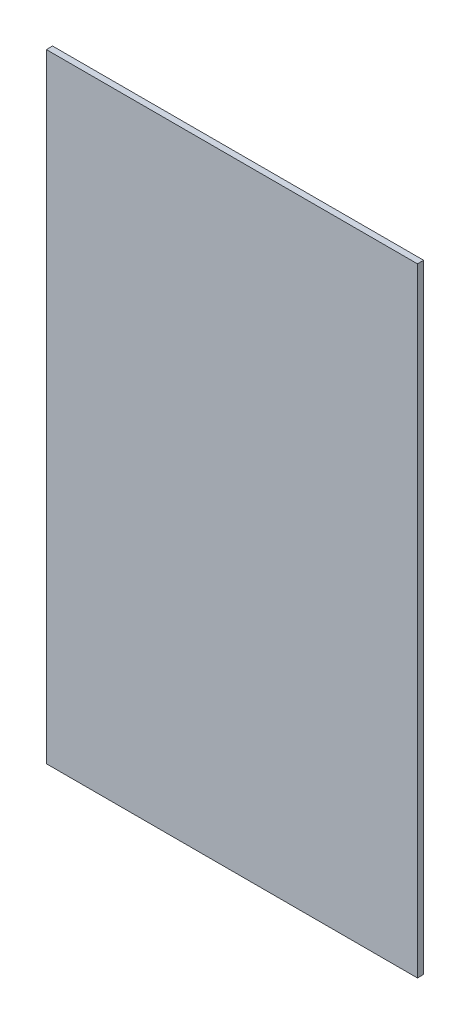
ISO-10303-21;
HEADER;
FILE_DESCRIPTION(('STEP AP214'),'2;1');
FILE_NAME('part.step','',(''),(''),'','','');
FILE_SCHEMA(('AUTOMOTIVE_DESIGN { 1 0 10303 214 1 1 1 1 }'));
ENDSEC;
DATA;
#1=APPLICATION_CONTEXT('core data for automotive mechanical design processes');
#2=APPLICATION_PROTOCOL_DEFINITION('international standard','automotive_design',2000,#1);
#3=PRODUCT_CONTEXT('',#1,'mechanical');
#4=PRODUCT('Part','Part','',(#3));
#5=PRODUCT_RELATED_PRODUCT_CATEGORY('part','',(#4));
#6=PRODUCT_DEFINITION_FORMATION('','',#4);
#7=PRODUCT_DEFINITION_CONTEXT('part definition',#1,'design');
#8=PRODUCT_DEFINITION('design','',#6,#7);
#9=PRODUCT_DEFINITION_SHAPE('','',#8);
#10=(LENGTH_UNIT() NAMED_UNIT(*) SI_UNIT(.MILLI.,.METRE.));
#11=(NAMED_UNIT(*) PLANE_ANGLE_UNIT() SI_UNIT($,.RADIAN.));
#12=(NAMED_UNIT(*) SI_UNIT($,.STERADIAN.) SOLID_ANGLE_UNIT());
#13=UNCERTAINTY_MEASURE_WITH_UNIT(LENGTH_MEASURE(1.E-05),#10,'distance_accuracy_value','');
#14=(GEOMETRIC_REPRESENTATION_CONTEXT(3) GLOBAL_UNCERTAINTY_ASSIGNED_CONTEXT((#13)) GLOBAL_UNIT_ASSIGNED_CONTEXT((#10,
#11,#12)) REPRESENTATION_CONTEXT('',''));
#15=CARTESIAN_POINT('',(0.,0.,0.));
#16=DIRECTION('',(0.,0.,1.));
#17=DIRECTION('',(1.,0.,0.));
#18=AXIS2_PLACEMENT_3D('',#15,#16,#17);
#19=CARTESIAN_POINT('',(-30.9627304007322,42.0574162679426,1.));
#20=DIRECTION('',(1.,0.,0.));
#21=DIRECTION('',(0.,1.,0.));
#22=AXIS2_PLACEMENT_3D('',#19,#20,#21);
#23=PLANE('',#22);
#24=DIRECTION('',(0.,-1.,0.));
#25=VECTOR('',#24,1.);
#26=CARTESIAN_POINT('',(-30.9627304007322,42.0574162679426,0.));
#27=LINE('',#26,#25);
#28=CARTESIAN_POINT('',(-30.9627304007322,42.0574162679426,0.));
#29=VERTEX_POINT('',#28);
#30=CARTESIAN_POINT('',(-30.9627304007322,-57.9425837320574,0.));
#31=VERTEX_POINT('',#30);
#32=EDGE_CURVE('E96',#29,#31,#27,.T.);
#33=ORIENTED_EDGE('',*,*,#32,.T.);
#34=DIRECTION('',(0.,0.,-1.));
#35=VECTOR('',#34,1.);
#36=CARTESIAN_POINT('',(-30.9627304007322,-57.9425837320574,1.));
#37=LINE('',#36,#35);
#38=CARTESIAN_POINT('',(-30.9627304007322,-57.9425837320574,1.));
#39=VERTEX_POINT('',#38);
#40=EDGE_CURVE('E11',#39,#31,#37,.T.);
#41=ORIENTED_EDGE('',*,*,#40,.F.);
#42=DIRECTION('',(0.,-1.,0.));
#43=VECTOR('',#42,1.);
#44=CARTESIAN_POINT('',(-30.9627304007322,42.0574162679426,1.));
#45=LINE('',#44,#43);
#46=CARTESIAN_POINT('',(-30.9627304007322,42.0574162679426,1.));
#47=VERTEX_POINT('',#46);
#48=EDGE_CURVE('E84',#47,#39,#45,.T.);
#49=ORIENTED_EDGE('',*,*,#48,.F.);
#50=DIRECTION('',(0.,0.,-1.));
#51=VECTOR('',#50,1.);
#52=CARTESIAN_POINT('',(-30.9627304007322,42.0574162679426,1.));
#53=LINE('',#52,#51);
#54=EDGE_CURVE('E92',#47,#29,#53,.T.);
#55=ORIENTED_EDGE('',*,*,#54,.T.);
#56=EDGE_LOOP('',(#33,#41,#49,#55));
#57=FACE_BOUND('',#56,.T.);
#58=ADVANCED_FACE('F33',(#57),#23,.F.);
#59=CARTESIAN_POINT('',(-30.9627304007322,-57.9425837320574,1.));
#60=DIRECTION('',(0.,1.,0.));
#61=DIRECTION('',(0.,0.,1.));
#62=AXIS2_PLACEMENT_3D('',#59,#60,#61);
#63=PLANE('',#62);
#64=DIRECTION('',(1.,0.,0.));
#65=VECTOR('',#64,1.);
#66=CARTESIAN_POINT('',(-30.9627304007322,-57.9425837320574,0.));
#67=LINE('',#66,#65);
#68=CARTESIAN_POINT('',(29.0372695992678,-57.9425837320574,0.));
#69=VERTEX_POINT('',#68);
#70=EDGE_CURVE('E88',#31,#69,#67,.T.);
#71=ORIENTED_EDGE('',*,*,#70,.T.);
#72=DIRECTION('',(0.,0.,-1.));
#73=VECTOR('',#72,1.);
#74=CARTESIAN_POINT('',(29.0372695992678,-57.9425837320574,1.));
#75=LINE('',#74,#73);
#76=CARTESIAN_POINT('',(29.0372695992678,-57.9425837320574,1.));
#77=VERTEX_POINT('',#76);
#78=EDGE_CURVE('E41',#77,#69,#75,.T.);
#79=ORIENTED_EDGE('',*,*,#78,.F.);
#80=DIRECTION('',(1.,0.,0.));
#81=VECTOR('',#80,1.);
#82=CARTESIAN_POINT('',(-30.9627304007322,-57.9425837320574,1.));
#83=LINE('',#82,#81);
#84=EDGE_CURVE('E79',#39,#77,#83,.T.);
#85=ORIENTED_EDGE('',*,*,#84,.F.);
#86=ORIENTED_EDGE('',*,*,#40,.T.);
#87=EDGE_LOOP('',(#71,#79,#85,#86));
#88=FACE_BOUND('',#87,.T.);
#89=ADVANCED_FACE('F87',(#88),#63,.F.);
#90=CARTESIAN_POINT('',(29.0372695992678,42.0574162679426,1.));
#91=DIRECTION('',(-1.,0.,0.));
#92=DIRECTION('',(0.,-1.,0.));
#93=AXIS2_PLACEMENT_3D('',#90,#91,#92);
#94=PLANE('',#93);
#95=DIRECTION('',(0.,1.,0.));
#96=VECTOR('',#95,1.);
#97=CARTESIAN_POINT('',(29.0372695992678,42.0574162679426,0.));
#98=LINE('',#97,#96);
#99=CARTESIAN_POINT('',(29.0372695992678,42.0574162679426,0.));
#100=VERTEX_POINT('',#99);
#101=EDGE_CURVE('E66',#69,#100,#98,.T.);
#102=ORIENTED_EDGE('',*,*,#101,.T.);
#103=DIRECTION('',(0.,0.,-1.));
#104=VECTOR('',#103,1.);
#105=CARTESIAN_POINT('',(29.0372695992678,42.0574162679426,1.));
#106=LINE('',#105,#104);
#107=CARTESIAN_POINT('',(29.0372695992678,42.0574162679426,1.));
#108=VERTEX_POINT('',#107);
#109=EDGE_CURVE('E89',#108,#100,#106,.T.);
#110=ORIENTED_EDGE('',*,*,#109,.F.);
#111=DIRECTION('',(0.,1.,0.));
#112=VECTOR('',#111,1.);
#113=CARTESIAN_POINT('',(29.0372695992678,42.0574162679426,1.));
#114=LINE('',#113,#112);
#115=EDGE_CURVE('E82',#77,#108,#114,.T.);
#116=ORIENTED_EDGE('',*,*,#115,.F.);
#117=ORIENTED_EDGE('',*,*,#78,.T.);
#118=EDGE_LOOP('',(#102,#110,#116,#117));
#119=FACE_BOUND('',#118,.T.);
#120=ADVANCED_FACE('F90',(#119),#94,.F.);
#121=CARTESIAN_POINT('',(-30.9627304007322,42.0574162679426,1.));
#122=DIRECTION('',(0.,-1.,0.));
#123=DIRECTION('',(0.,0.,-1.));
#124=AXIS2_PLACEMENT_3D('',#121,#122,#123);
#125=PLANE('',#124);
#126=DIRECTION('',(-1.,0.,0.));
#127=VECTOR('',#126,1.);
#128=CARTESIAN_POINT('',(-30.9627304007322,42.0574162679426,0.));
#129=LINE('',#128,#127);
#130=EDGE_CURVE('E72',#100,#29,#129,.T.);
#131=ORIENTED_EDGE('',*,*,#130,.T.);
#132=ORIENTED_EDGE('',*,*,#54,.F.);
#133=DIRECTION('',(-1.,0.,0.));
#134=VECTOR('',#133,1.);
#135=CARTESIAN_POINT('',(-30.9627304007322,42.0574162679426,1.));
#136=LINE('',#135,#134);
#137=EDGE_CURVE('E49',#108,#47,#136,.T.);
#138=ORIENTED_EDGE('',*,*,#137,.F.);
#139=ORIENTED_EDGE('',*,*,#109,.T.);
#140=EDGE_LOOP('',(#131,#132,#138,#139));
#141=FACE_BOUND('',#140,.T.);
#142=ADVANCED_FACE('F103',(#141),#125,.F.);
#143=CARTESIAN_POINT('',(0.,0.,1.));
#144=DIRECTION('',(0.,0.,1.));
#145=DIRECTION('',(1.,0.,0.));
#146=AXIS2_PLACEMENT_3D('',#143,#144,#145);
#147=PLANE('',#146);
#148=ORIENTED_EDGE('',*,*,#48,.T.);
#149=ORIENTED_EDGE('',*,*,#84,.T.);
#150=ORIENTED_EDGE('',*,*,#115,.T.);
#151=ORIENTED_EDGE('',*,*,#137,.T.);
#152=EDGE_LOOP('',(#148,#149,#150,#151));
#153=FACE_BOUND('',#152,.T.);
#154=ADVANCED_FACE('F80',(#153),#147,.T.);
#155=CARTESIAN_POINT('',(0.,0.,0.));
#156=DIRECTION('',(0.,0.,1.));
#157=DIRECTION('',(1.,0.,0.));
#158=AXIS2_PLACEMENT_3D('',#155,#156,#157);
#159=PLANE('',#158);
#160=ORIENTED_EDGE('',*,*,#32,.F.);
#161=ORIENTED_EDGE('',*,*,#130,.F.);
#162=ORIENTED_EDGE('',*,*,#101,.F.);
#163=ORIENTED_EDGE('',*,*,#70,.F.);
#164=EDGE_LOOP('',(#160,#161,#162,#163));
#165=FACE_BOUND('',#164,.T.);
#166=ADVANCED_FACE('F106',(#165),#159,.F.);
#167=CLOSED_SHELL('',(#58,#89,#120,#142,#154,#166));
#168=MANIFOLD_SOLID_BREP('B2',#167);
#169=ADVANCED_BREP_SHAPE_REPRESENTATION('',(#18,#168),#14);
#170=SHAPE_DEFINITION_REPRESENTATION(#9,#169);
ENDSEC;
END-ISO-10303-21;
